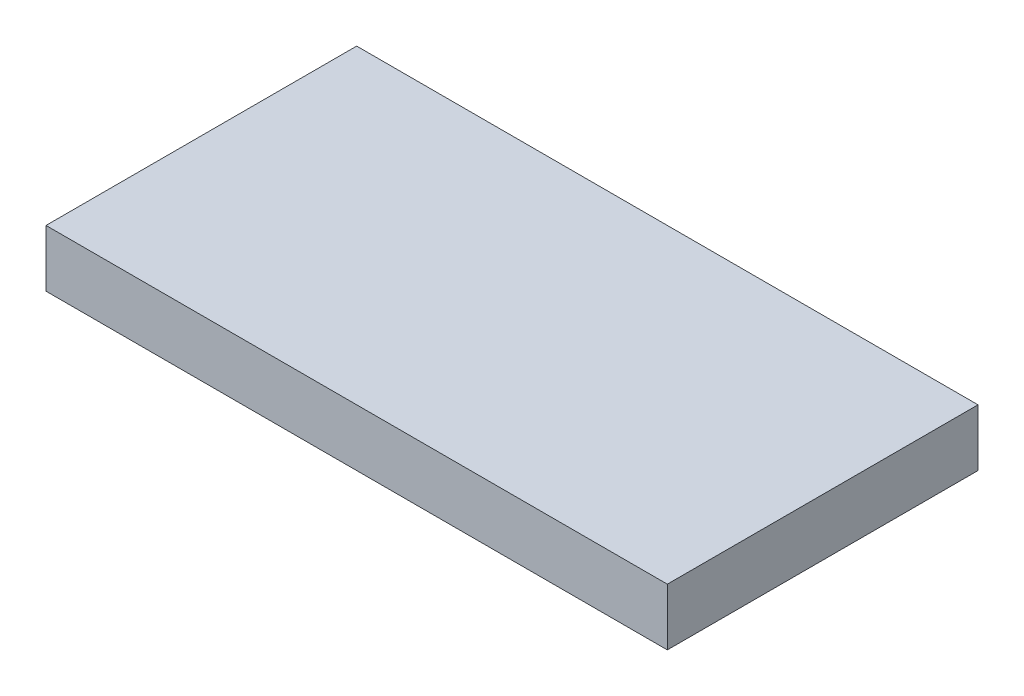
ISO-10303-21;
HEADER;
FILE_DESCRIPTION(('STEP AP214'),'2;1');
FILE_NAME('part.step','',(''),(''),'','','');
FILE_SCHEMA(('AUTOMOTIVE_DESIGN { 1 0 10303 214 1 1 1 1 }'));
ENDSEC;
DATA;
#1=APPLICATION_CONTEXT('core data for automotive mechanical design processes');
#2=APPLICATION_PROTOCOL_DEFINITION('international standard','automotive_design',2000,#1);
#3=PRODUCT_CONTEXT('',#1,'mechanical');
#4=PRODUCT('Part','Part','',(#3));
#5=PRODUCT_RELATED_PRODUCT_CATEGORY('part','',(#4));
#6=PRODUCT_DEFINITION_FORMATION('','',#4);
#7=PRODUCT_DEFINITION_CONTEXT('part definition',#1,'design');
#8=PRODUCT_DEFINITION('design','',#6,#7);
#9=PRODUCT_DEFINITION_SHAPE('','',#8);
#10=(LENGTH_UNIT() NAMED_UNIT(*) SI_UNIT(.MILLI.,.METRE.));
#11=(NAMED_UNIT(*) PLANE_ANGLE_UNIT() SI_UNIT($,.RADIAN.));
#12=(NAMED_UNIT(*) SI_UNIT($,.STERADIAN.) SOLID_ANGLE_UNIT());
#13=UNCERTAINTY_MEASURE_WITH_UNIT(LENGTH_MEASURE(1.E-05),#10,'distance_accuracy_value','');
#14=(GEOMETRIC_REPRESENTATION_CONTEXT(3) GLOBAL_UNCERTAINTY_ASSIGNED_CONTEXT((#13)) GLOBAL_UNIT_ASSIGNED_CONTEXT((#10,
#11,#12)) REPRESENTATION_CONTEXT('',''));
#15=CARTESIAN_POINT('',(0.,0.,0.));
#16=DIRECTION('',(0.,0.,1.));
#17=DIRECTION('',(1.,0.,0.));
#18=AXIS2_PLACEMENT_3D('',#15,#16,#17);
#19=CARTESIAN_POINT('',(0.,55.,-300.));
#20=DIRECTION('',(1.,0.,0.));
#21=DIRECTION('',(0.,0.,-1.));
#22=AXIS2_PLACEMENT_3D('',#19,#20,#21);
#23=PLANE('',#22);
#24=DIRECTION('',(0.,0.,1.));
#25=VECTOR('',#24,1.);
#26=CARTESIAN_POINT('',(0.,0.,-300.));
#27=LINE('',#26,#25);
#28=CARTESIAN_POINT('',(0.,0.,-300.));
#29=VERTEX_POINT('',#28);
#30=CARTESIAN_POINT('',(0.,0.,0.));
#31=VERTEX_POINT('',#30);
#32=EDGE_CURVE('E93',#29,#31,#27,.T.);
#33=ORIENTED_EDGE('',*,*,#32,.T.);
#34=DIRECTION('',(0.,-1.,0.));
#35=VECTOR('',#34,1.);
#36=CARTESIAN_POINT('',(0.,55.,0.));
#37=LINE('',#36,#35);
#38=CARTESIAN_POINT('',(0.,55.,0.));
#39=VERTEX_POINT('',#38);
#40=EDGE_CURVE('E11',#39,#31,#37,.T.);
#41=ORIENTED_EDGE('',*,*,#40,.F.);
#42=DIRECTION('',(0.,0.,1.));
#43=VECTOR('',#42,1.);
#44=CARTESIAN_POINT('',(0.,55.,-300.));
#45=LINE('',#44,#43);
#46=CARTESIAN_POINT('',(0.,55.,-300.));
#47=VERTEX_POINT('',#46);
#48=EDGE_CURVE('E81',#47,#39,#45,.T.);
#49=ORIENTED_EDGE('',*,*,#48,.F.);
#50=DIRECTION('',(0.,-1.,0.));
#51=VECTOR('',#50,1.);
#52=CARTESIAN_POINT('',(0.,55.,-300.));
#53=LINE('',#52,#51);
#54=EDGE_CURVE('E89',#47,#29,#53,.T.);
#55=ORIENTED_EDGE('',*,*,#54,.T.);
#56=EDGE_LOOP('',(#33,#41,#49,#55));
#57=FACE_BOUND('',#56,.T.);
#58=ADVANCED_FACE('F30',(#57),#23,.F.);
#59=CARTESIAN_POINT('',(0.,55.,0.));
#60=DIRECTION('',(0.,0.,-1.));
#61=DIRECTION('',(-1.,0.,0.));
#62=AXIS2_PLACEMENT_3D('',#59,#60,#61);
#63=PLANE('',#62);
#64=DIRECTION('',(1.,0.,0.));
#65=VECTOR('',#64,1.);
#66=CARTESIAN_POINT('',(0.,0.,0.));
#67=LINE('',#66,#65);
#68=CARTESIAN_POINT('',(600.,0.,0.));
#69=VERTEX_POINT('',#68);
#70=EDGE_CURVE('E85',#31,#69,#67,.T.);
#71=ORIENTED_EDGE('',*,*,#70,.T.);
#72=DIRECTION('',(0.,-1.,0.));
#73=VECTOR('',#72,1.);
#74=CARTESIAN_POINT('',(600.,55.,0.));
#75=LINE('',#74,#73);
#76=CARTESIAN_POINT('',(600.,55.,0.));
#77=VERTEX_POINT('',#76);
#78=EDGE_CURVE('E38',#77,#69,#75,.T.);
#79=ORIENTED_EDGE('',*,*,#78,.F.);
#80=DIRECTION('',(1.,0.,0.));
#81=VECTOR('',#80,1.);
#82=CARTESIAN_POINT('',(0.,55.,0.));
#83=LINE('',#82,#81);
#84=EDGE_CURVE('E76',#39,#77,#83,.T.);
#85=ORIENTED_EDGE('',*,*,#84,.F.);
#86=ORIENTED_EDGE('',*,*,#40,.T.);
#87=EDGE_LOOP('',(#71,#79,#85,#86));
#88=FACE_BOUND('',#87,.T.);
#89=ADVANCED_FACE('F84',(#88),#63,.F.);
#90=CARTESIAN_POINT('',(600.,55.,-300.));
#91=DIRECTION('',(-1.,0.,0.));
#92=DIRECTION('',(0.,0.,1.));
#93=AXIS2_PLACEMENT_3D('',#90,#91,#92);
#94=PLANE('',#93);
#95=DIRECTION('',(0.,0.,-1.));
#96=VECTOR('',#95,1.);
#97=CARTESIAN_POINT('',(600.,0.,-300.));
#98=LINE('',#97,#96);
#99=CARTESIAN_POINT('',(600.,0.,-300.));
#100=VERTEX_POINT('',#99);
#101=EDGE_CURVE('E63',#69,#100,#98,.T.);
#102=ORIENTED_EDGE('',*,*,#101,.T.);
#103=DIRECTION('',(0.,-1.,0.));
#104=VECTOR('',#103,1.);
#105=CARTESIAN_POINT('',(600.,55.,-300.));
#106=LINE('',#105,#104);
#107=CARTESIAN_POINT('',(600.,55.,-300.));
#108=VERTEX_POINT('',#107);
#109=EDGE_CURVE('E86',#108,#100,#106,.T.);
#110=ORIENTED_EDGE('',*,*,#109,.F.);
#111=DIRECTION('',(0.,0.,-1.));
#112=VECTOR('',#111,1.);
#113=CARTESIAN_POINT('',(600.,55.,-300.));
#114=LINE('',#113,#112);
#115=EDGE_CURVE('E79',#77,#108,#114,.T.);
#116=ORIENTED_EDGE('',*,*,#115,.F.);
#117=ORIENTED_EDGE('',*,*,#78,.T.);
#118=EDGE_LOOP('',(#102,#110,#116,#117));
#119=FACE_BOUND('',#118,.T.);
#120=ADVANCED_FACE('F87',(#119),#94,.F.);
#121=CARTESIAN_POINT('',(0.,55.,-300.));
#122=DIRECTION('',(0.,0.,1.));
#123=DIRECTION('',(1.,0.,0.));
#124=AXIS2_PLACEMENT_3D('',#121,#122,#123);
#125=PLANE('',#124);
#126=DIRECTION('',(-1.,0.,0.));
#127=VECTOR('',#126,1.);
#128=CARTESIAN_POINT('',(0.,0.,-300.));
#129=LINE('',#128,#127);
#130=EDGE_CURVE('E69',#100,#29,#129,.T.);
#131=ORIENTED_EDGE('',*,*,#130,.T.);
#132=ORIENTED_EDGE('',*,*,#54,.F.);
#133=DIRECTION('',(-1.,0.,0.));
#134=VECTOR('',#133,1.);
#135=CARTESIAN_POINT('',(0.,55.,-300.));
#136=LINE('',#135,#134);
#137=EDGE_CURVE('E46',#108,#47,#136,.T.);
#138=ORIENTED_EDGE('',*,*,#137,.F.);
#139=ORIENTED_EDGE('',*,*,#109,.T.);
#140=EDGE_LOOP('',(#131,#132,#138,#139));
#141=FACE_BOUND('',#140,.T.);
#142=ADVANCED_FACE('F100',(#141),#125,.F.);
#143=CARTESIAN_POINT('',(0.,55.,0.));
#144=DIRECTION('',(0.,1.,0.));
#145=DIRECTION('',(0.,0.,1.));
#146=AXIS2_PLACEMENT_3D('',#143,#144,#145);
#147=PLANE('',#146);
#148=ORIENTED_EDGE('',*,*,#48,.T.);
#149=ORIENTED_EDGE('',*,*,#84,.T.);
#150=ORIENTED_EDGE('',*,*,#115,.T.);
#151=ORIENTED_EDGE('',*,*,#137,.T.);
#152=EDGE_LOOP('',(#148,#149,#150,#151));
#153=FACE_BOUND('',#152,.T.);
#154=ADVANCED_FACE('F77',(#153),#147,.T.);
#155=CARTESIAN_POINT('',(0.,0.,0.));
#156=DIRECTION('',(0.,1.,0.));
#157=DIRECTION('',(0.,0.,1.));
#158=AXIS2_PLACEMENT_3D('',#155,#156,#157);
#159=PLANE('',#158);
#160=ORIENTED_EDGE('',*,*,#32,.F.);
#161=ORIENTED_EDGE('',*,*,#130,.F.);
#162=ORIENTED_EDGE('',*,*,#101,.F.);
#163=ORIENTED_EDGE('',*,*,#70,.F.);
#164=EDGE_LOOP('',(#160,#161,#162,#163));
#165=FACE_BOUND('',#164,.T.);
#166=ADVANCED_FACE('F103',(#165),#159,.F.);
#167=CLOSED_SHELL('',(#58,#89,#120,#142,#154,#166));
#168=MANIFOLD_SOLID_BREP('B2',#167);
#169=ADVANCED_BREP_SHAPE_REPRESENTATION('',(#18,#168),#14);
#170=SHAPE_DEFINITION_REPRESENTATION(#9,#169);
ENDSEC;
END-ISO-10303-21;
